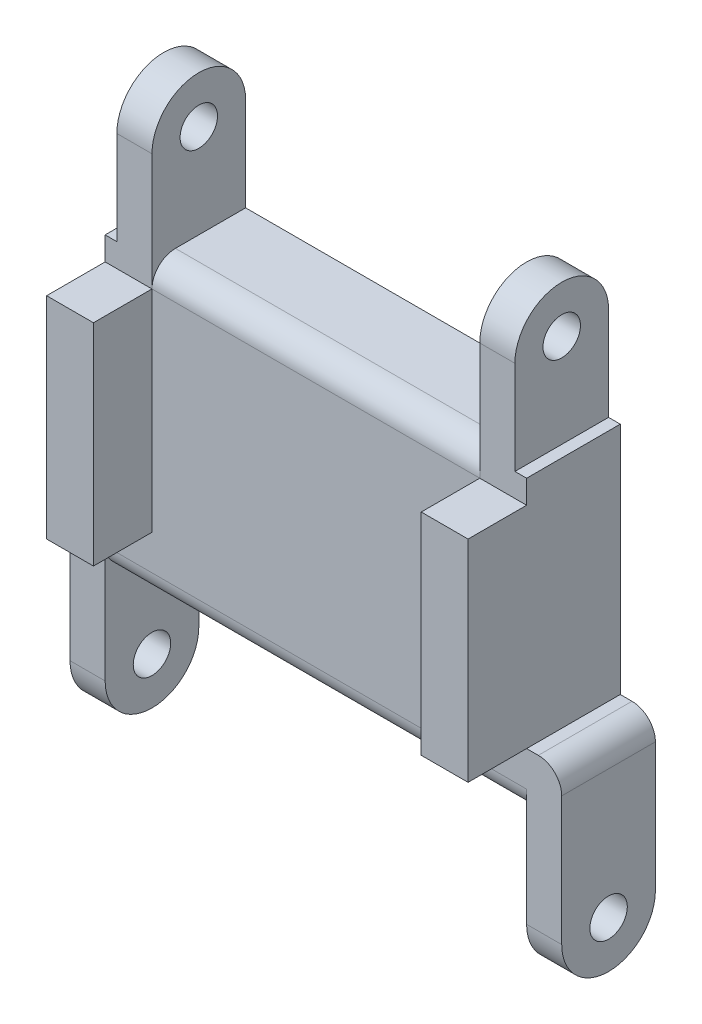
ISO-10303-21;
HEADER;
FILE_DESCRIPTION(('STEP AP214'),'2;1');
FILE_NAME('part.step','',(''),(''),'','','');
FILE_SCHEMA(('AUTOMOTIVE_DESIGN { 1 0 10303 214 1 1 1 1 }'));
ENDSEC;
DATA;
#1=APPLICATION_CONTEXT('core data for automotive mechanical design processes');
#2=APPLICATION_PROTOCOL_DEFINITION('international standard','automotive_design',2000,#1);
#3=PRODUCT_CONTEXT('',#1,'mechanical');
#4=PRODUCT('Part','Part','',(#3));
#5=PRODUCT_RELATED_PRODUCT_CATEGORY('part','',(#4));
#6=PRODUCT_DEFINITION_FORMATION('','',#4);
#7=PRODUCT_DEFINITION_CONTEXT('part definition',#1,'design');
#8=PRODUCT_DEFINITION('design','',#6,#7);
#9=PRODUCT_DEFINITION_SHAPE('','',#8);
#10=(LENGTH_UNIT() NAMED_UNIT(*) SI_UNIT(.MILLI.,.METRE.));
#11=(NAMED_UNIT(*) PLANE_ANGLE_UNIT() SI_UNIT($,.RADIAN.));
#12=(NAMED_UNIT(*) SI_UNIT($,.STERADIAN.) SOLID_ANGLE_UNIT());
#13=UNCERTAINTY_MEASURE_WITH_UNIT(LENGTH_MEASURE(1.E-05),#10,'distance_accuracy_value','');
#14=(GEOMETRIC_REPRESENTATION_CONTEXT(3) GLOBAL_UNCERTAINTY_ASSIGNED_CONTEXT((#13)) GLOBAL_UNIT_ASSIGNED_CONTEXT((#10,
#11,#12)) REPRESENTATION_CONTEXT('',''));
#15=CARTESIAN_POINT('',(0.,0.,0.));
#16=DIRECTION('',(0.,0.,1.));
#17=DIRECTION('',(1.,0.,0.));
#18=AXIS2_PLACEMENT_3D('',#15,#16,#17);
#19=CARTESIAN_POINT('',(0.,0.,8.));
#20=DIRECTION('',(0.,0.,-1.));
#21=DIRECTION('',(-1.,0.,0.));
#22=AXIS2_PLACEMENT_3D('',#19,#20,#21);
#23=PLANE('',#22);
#24=DIRECTION('',(1.,0.,0.));
#25=VECTOR('',#24,1.);
#26=CARTESIAN_POINT('',(32.,5.,8.));
#27=LINE('',#26,#25);
#28=CARTESIAN_POINT('',(32.,5.,8.));
#29=VERTEX_POINT('',#28);
#30=CARTESIAN_POINT('',(36.,5.,8.));
#31=VERTEX_POINT('',#30);
#32=EDGE_CURVE('E78',#29,#31,#27,.T.);
#33=ORIENTED_EDGE('',*,*,#32,.F.);
#34=DIRECTION('',(0.,-1.,0.));
#35=VECTOR('',#34,1.);
#36=CARTESIAN_POINT('',(32.,23.,8.));
#37=LINE('',#36,#35);
#38=CARTESIAN_POINT('',(32.,23.,8.));
#39=VERTEX_POINT('',#38);
#40=EDGE_CURVE('E303',#39,#29,#37,.T.);
#41=ORIENTED_EDGE('',*,*,#40,.F.);
#42=DIRECTION('',(-1.,0.,0.));
#43=VECTOR('',#42,1.);
#44=CARTESIAN_POINT('',(0.,23.,8.));
#45=LINE('',#44,#43);
#46=CARTESIAN_POINT('',(4.,23.,8.));
#47=VERTEX_POINT('',#46);
#48=EDGE_CURVE('E610',#39,#47,#45,.T.);
#49=ORIENTED_EDGE('',*,*,#48,.T.);
#50=DIRECTION('',(0.,1.,0.));
#51=VECTOR('',#50,1.);
#52=CARTESIAN_POINT('',(4.,23.,8.));
#53=LINE('',#52,#51);
#54=CARTESIAN_POINT('',(4.,5.,8.));
#55=VERTEX_POINT('',#54);
#56=EDGE_CURVE('E307',#55,#47,#53,.T.);
#57=ORIENTED_EDGE('',*,*,#56,.F.);
#58=DIRECTION('',(1.,0.,0.));
#59=VECTOR('',#58,1.);
#60=CARTESIAN_POINT('',(4.,5.,8.));
#61=LINE('',#60,#59);
#62=CARTESIAN_POINT('',(0.,5.,8.));
#63=VERTEX_POINT('',#62);
#64=EDGE_CURVE('E324',#63,#55,#61,.T.);
#65=ORIENTED_EDGE('',*,*,#64,.F.);
#66=DIRECTION('',(1.,0.,0.));
#67=VECTOR('',#66,1.);
#68=CARTESIAN_POINT('',(-3.,5.,8.));
#69=LINE('',#68,#67);
#70=CARTESIAN_POINT('',(-1.,5.,8.));
#71=VERTEX_POINT('',#70);
#72=EDGE_CURVE('E438',#71,#63,#69,.T.);
#73=ORIENTED_EDGE('',*,*,#72,.F.);
#74=CARTESIAN_POINT('',(-1.,3.,8.));
#75=DIRECTION('',(0.,0.,-1.));
#76=DIRECTION('',(-1.,0.,0.));
#77=AXIS2_PLACEMENT_3D('',#74,#75,#76);
#78=CIRCLE('',#77,2.);
#79=CARTESIAN_POINT('',(-3.,3.,8.));
#80=VERTEX_POINT('',#79);
#81=EDGE_CURVE('E580',#71,#80,#78,.F.);
#82=ORIENTED_EDGE('',*,*,#81,.T.);
#83=DIRECTION('',(0.,1.,0.));
#84=VECTOR('',#83,1.);
#85=CARTESIAN_POINT('',(-3.,0.,8.));
#86=LINE('',#85,#84);
#87=CARTESIAN_POINT('',(-3.,-8.,8.));
#88=VERTEX_POINT('',#87);
#89=EDGE_CURVE('E412',#88,#80,#86,.T.);
#90=ORIENTED_EDGE('',*,*,#89,.F.);
#91=DIRECTION('',(1.,0.,0.));
#92=VECTOR('',#91,1.);
#93=CARTESIAN_POINT('',(-3.,-8.,8.));
#94=LINE('',#93,#92);
#95=CARTESIAN_POINT('',(0.,-8.,8.));
#96=VERTEX_POINT('',#95);
#97=EDGE_CURVE('E442',#88,#96,#94,.T.);
#98=ORIENTED_EDGE('',*,*,#97,.T.);
#99=DIRECTION('',(0.,1.,0.));
#100=VECTOR('',#99,1.);
#101=CARTESIAN_POINT('',(0.,0.,8.));
#102=LINE('',#101,#100);
#103=CARTESIAN_POINT('',(0.,2.,8.));
#104=VERTEX_POINT('',#103);
#105=EDGE_CURVE('E426',#96,#104,#102,.T.);
#106=ORIENTED_EDGE('',*,*,#105,.T.);
#107=DIRECTION('',(1.,0.,0.));
#108=VECTOR('',#107,1.);
#109=CARTESIAN_POINT('',(0.,2.,8.));
#110=LINE('',#109,#108);
#111=CARTESIAN_POINT('',(36.,2.,8.));
#112=VERTEX_POINT('',#111);
#113=EDGE_CURVE('E596',#104,#112,#110,.T.);
#114=ORIENTED_EDGE('',*,*,#113,.T.);
#115=DIRECTION('',(0.,1.,0.));
#116=VECTOR('',#115,1.);
#117=CARTESIAN_POINT('',(36.,25.,8.));
#118=LINE('',#117,#116);
#119=CARTESIAN_POINT('',(36.,-8.,8.));
#120=VERTEX_POINT('',#119);
#121=EDGE_CURVE('E386',#120,#112,#118,.T.);
#122=ORIENTED_EDGE('',*,*,#121,.F.);
#123=DIRECTION('',(-1.,0.,0.));
#124=VECTOR('',#123,1.);
#125=CARTESIAN_POINT('',(39.,-8.,8.));
#126=LINE('',#125,#124);
#127=CARTESIAN_POINT('',(39.,-8.,8.));
#128=VERTEX_POINT('',#127);
#129=EDGE_CURVE('E399',#128,#120,#126,.T.);
#130=ORIENTED_EDGE('',*,*,#129,.F.);
#131=DIRECTION('',(0.,1.,0.));
#132=VECTOR('',#131,1.);
#133=CARTESIAN_POINT('',(39.,25.,8.));
#134=LINE('',#133,#132);
#135=CARTESIAN_POINT('',(39.,3.,8.));
#136=VERTEX_POINT('',#135);
#137=EDGE_CURVE('E375',#128,#136,#134,.T.);
#138=ORIENTED_EDGE('',*,*,#137,.T.);
#139=CARTESIAN_POINT('',(37.,3.,8.));
#140=DIRECTION('',(0.,0.,-1.));
#141=DIRECTION('',(-1.,0.,0.));
#142=AXIS2_PLACEMENT_3D('',#139,#140,#141);
#143=CIRCLE('',#142,2.);
#144=CARTESIAN_POINT('',(37.,5.,8.));
#145=VERTEX_POINT('',#144);
#146=EDGE_CURVE('E593',#136,#145,#143,.F.);
#147=ORIENTED_EDGE('',*,*,#146,.T.);
#148=DIRECTION('',(-1.,0.,0.));
#149=VECTOR('',#148,1.);
#150=CARTESIAN_POINT('',(39.,5.,8.));
#151=LINE('',#150,#149);
#152=EDGE_CURVE('E396',#145,#31,#151,.T.);
#153=ORIENTED_EDGE('',*,*,#152,.T.);
#154=EDGE_LOOP('',(#33,#41,#49,#57,#65,#73,#82,#90,#98,#106,#114,#122,#130,#138,#147,#153));
#155=FACE_BOUND('',#154,.T.);
#156=ADVANCED_FACE('F62',(#155),#23,.F.);
#157=DIRECTION('',(-1.,0.,0.));
#158=VECTOR('',#157,1.);
#159=CARTESIAN_POINT('',(32.,23.,8.));
#160=LINE('',#159,#158);
#161=CARTESIAN_POINT('',(36.,23.,8.));
#162=VERTEX_POINT('',#161);
#163=EDGE_CURVE('E277',#162,#39,#160,.T.);
#164=ORIENTED_EDGE('',*,*,#163,.F.);
#165=DIRECTION('',(0.,1.,0.));
#166=VECTOR('',#165,1.);
#167=CARTESIAN_POINT('',(36.,25.,8.));
#168=LINE('',#167,#166);
#169=CARTESIAN_POINT('',(36.,25.,8.));
#170=VERTEX_POINT('',#169);
#171=EDGE_CURVE('E260',#162,#170,#168,.T.);
#172=ORIENTED_EDGE('',*,*,#171,.T.);
#173=DIRECTION('',(-1.,0.,0.));
#174=VECTOR('',#173,1.);
#175=CARTESIAN_POINT('',(0.,25.,8.));
#176=LINE('',#175,#174);
#177=CARTESIAN_POINT('',(35.,25.,8.));
#178=VERTEX_POINT('',#177);
#179=EDGE_CURVE('E541',#170,#178,#176,.T.);
#180=ORIENTED_EDGE('',*,*,#179,.T.);
#181=DIRECTION('',(0.,1.,0.));
#182=VECTOR('',#181,1.);
#183=CARTESIAN_POINT('',(35.,0.,8.));
#184=LINE('',#183,#182);
#185=CARTESIAN_POINT('',(35.,33.,8.));
#186=VERTEX_POINT('',#185);
#187=EDGE_CURVE('E522',#178,#186,#184,.T.);
#188=ORIENTED_EDGE('',*,*,#187,.T.);
#189=DIRECTION('',(1.,0.,0.));
#190=VECTOR('',#189,1.);
#191=CARTESIAN_POINT('',(32.,33.,8.));
#192=LINE('',#191,#190);
#193=CARTESIAN_POINT('',(32.,33.,8.));
#194=VERTEX_POINT('',#193);
#195=EDGE_CURVE('E532',#194,#186,#192,.T.);
#196=ORIENTED_EDGE('',*,*,#195,.F.);
#197=DIRECTION('',(0.,1.,0.));
#198=VECTOR('',#197,1.);
#199=CARTESIAN_POINT('',(32.,0.,8.));
#200=LINE('',#199,#198);
#201=EDGE_CURVE('E280',#39,#194,#200,.T.);
#202=ORIENTED_EDGE('',*,*,#201,.F.);
#203=EDGE_LOOP('',(#164,#172,#180,#188,#196,#202));
#204=FACE_BOUND('',#203,.T.);
#205=ADVANCED_FACE('F278',(#204),#23,.F.);
#206=DIRECTION('',(-1.,0.,0.));
#207=VECTOR('',#206,1.);
#208=CARTESIAN_POINT('',(4.,23.,8.));
#209=LINE('',#208,#207);
#210=CARTESIAN_POINT('',(0.,23.,8.));
#211=VERTEX_POINT('',#210);
#212=EDGE_CURVE('E337',#47,#211,#209,.T.);
#213=ORIENTED_EDGE('',*,*,#212,.F.);
#214=DIRECTION('',(0.,1.,0.));
#215=VECTOR('',#214,1.);
#216=CARTESIAN_POINT('',(4.,0.,8.));
#217=LINE('',#216,#215);
#218=CARTESIAN_POINT('',(4.,33.,8.));
#219=VERTEX_POINT('',#218);
#220=EDGE_CURVE('E459',#47,#219,#217,.T.);
#221=ORIENTED_EDGE('',*,*,#220,.T.);
#222=DIRECTION('',(-1.,0.,0.));
#223=VECTOR('',#222,1.);
#224=CARTESIAN_POINT('',(4.,33.,8.));
#225=LINE('',#224,#223);
#226=CARTESIAN_POINT('',(1.,33.,8.));
#227=VERTEX_POINT('',#226);
#228=EDGE_CURVE('E491',#219,#227,#225,.T.);
#229=ORIENTED_EDGE('',*,*,#228,.T.);
#230=DIRECTION('',(0.,1.,0.));
#231=VECTOR('',#230,1.);
#232=CARTESIAN_POINT('',(1.,0.,8.));
#233=LINE('',#232,#231);
#234=CARTESIAN_POINT('',(1.,25.,8.));
#235=VERTEX_POINT('',#234);
#236=EDGE_CURVE('E478',#235,#227,#233,.T.);
#237=ORIENTED_EDGE('',*,*,#236,.F.);
#238=CARTESIAN_POINT('',(0.,25.,8.));
#239=VERTEX_POINT('',#238);
#240=EDGE_CURVE('E273',#235,#239,#176,.T.);
#241=ORIENTED_EDGE('',*,*,#240,.T.);
#242=DIRECTION('',(0.,-1.,0.));
#243=VECTOR('',#242,1.);
#244=CARTESIAN_POINT('',(0.,0.,8.));
#245=LINE('',#244,#243);
#246=EDGE_CURVE('E86',#239,#211,#245,.T.);
#247=ORIENTED_EDGE('',*,*,#246,.T.);
#248=EDGE_LOOP('',(#213,#221,#229,#237,#241,#247));
#249=FACE_BOUND('',#248,.T.);
#250=ADVANCED_FACE('F729',(#249),#23,.F.);
#251=CARTESIAN_POINT('',(0.,0.,8.));
#252=DIRECTION('',(1.,0.,0.));
#253=DIRECTION('',(0.,0.,-1.));
#254=AXIS2_PLACEMENT_3D('',#251,#252,#253);
#255=PLANE('',#254);
#256=DIRECTION('',(0.,0.,-1.));
#257=VECTOR('',#256,1.);
#258=CARTESIAN_POINT('',(0.,5.,0.));
#259=LINE('',#258,#257);
#260=CARTESIAN_POINT('',(0.,5.,0.));
#261=VERTEX_POINT('',#260);
#262=EDGE_CURVE('E429',#63,#261,#259,.T.);
#263=ORIENTED_EDGE('',*,*,#262,.F.);
#264=DIRECTION('',(0.,0.,-1.));
#265=VECTOR('',#264,1.);
#266=CARTESIAN_POINT('',(0.,5.,13.));
#267=LINE('',#266,#265);
#268=CARTESIAN_POINT('',(0.,5.,13.));
#269=VERTEX_POINT('',#268);
#270=EDGE_CURVE('E346',#269,#63,#267,.T.);
#271=ORIENTED_EDGE('',*,*,#270,.F.);
#272=DIRECTION('',(0.,-1.,0.));
#273=VECTOR('',#272,1.);
#274=CARTESIAN_POINT('',(0.,23.,13.));
#275=LINE('',#274,#273);
#276=CARTESIAN_POINT('',(0.,23.,13.));
#277=VERTEX_POINT('',#276);
#278=EDGE_CURVE('E327',#277,#269,#275,.T.);
#279=ORIENTED_EDGE('',*,*,#278,.F.);
#280=DIRECTION('',(0.,0.,-1.));
#281=VECTOR('',#280,1.);
#282=CARTESIAN_POINT('',(0.,23.,13.));
#283=LINE('',#282,#281);
#284=EDGE_CURVE('E350',#277,#211,#283,.T.);
#285=ORIENTED_EDGE('',*,*,#284,.T.);
#286=ORIENTED_EDGE('',*,*,#246,.F.);
#287=DIRECTION('',(0.,0.,-1.));
#288=VECTOR('',#287,1.);
#289=CARTESIAN_POINT('',(0.,25.,8.));
#290=LINE('',#289,#288);
#291=CARTESIAN_POINT('',(0.,25.,0.));
#292=VERTEX_POINT('',#291);
#293=EDGE_CURVE('E544',#239,#292,#290,.T.);
#294=ORIENTED_EDGE('',*,*,#293,.T.);
#295=DIRECTION('',(0.,-1.,0.));
#296=VECTOR('',#295,1.);
#297=CARTESIAN_POINT('',(0.,0.,0.));
#298=LINE('',#297,#296);
#299=EDGE_CURVE('E535',#292,#261,#298,.T.);
#300=ORIENTED_EDGE('',*,*,#299,.T.);
#301=EDGE_LOOP('',(#263,#271,#279,#285,#286,#294,#300));
#302=FACE_BOUND('',#301,.T.);
#303=ADVANCED_FACE('F649',(#302),#255,.F.);
#304=CARTESIAN_POINT('',(0.,25.,8.));
#305=DIRECTION('',(0.,-1.,0.));
#306=DIRECTION('',(0.,0.,-1.));
#307=AXIS2_PLACEMENT_3D('',#304,#305,#306);
#308=PLANE('',#307);
#309=DIRECTION('',(0.,0.,1.));
#310=VECTOR('',#309,1.);
#311=CARTESIAN_POINT('',(1.,25.,0.));
#312=LINE('',#311,#310);
#313=CARTESIAN_POINT('',(1.,25.,0.));
#314=VERTEX_POINT('',#313);
#315=EDGE_CURVE('E482',#314,#235,#312,.T.);
#316=ORIENTED_EDGE('',*,*,#315,.F.);
#317=DIRECTION('',(-1.,0.,0.));
#318=VECTOR('',#317,1.);
#319=CARTESIAN_POINT('',(0.,25.,0.));
#320=LINE('',#319,#318);
#321=EDGE_CURVE('E555',#314,#292,#320,.T.);
#322=ORIENTED_EDGE('',*,*,#321,.T.);
#323=ORIENTED_EDGE('',*,*,#293,.F.);
#324=ORIENTED_EDGE('',*,*,#240,.F.);
#325=EDGE_LOOP('',(#316,#322,#323,#324));
#326=FACE_BOUND('',#325,.T.);
#327=ADVANCED_FACE('F644',(#326),#308,.F.);
#328=DIRECTION('',(0.,0.,1.));
#329=VECTOR('',#328,1.);
#330=CARTESIAN_POINT('',(4.,25.,0.));
#331=LINE('',#330,#329);
#332=CARTESIAN_POINT('',(4.,25.,0.));
#333=VERTEX_POINT('',#332);
#334=CARTESIAN_POINT('',(4.,25.,6.));
#335=VERTEX_POINT('',#334);
#336=EDGE_CURVE('E463',#333,#335,#331,.T.);
#337=ORIENTED_EDGE('',*,*,#336,.T.);
#338=DIRECTION('',(-1.,0.,0.));
#339=VECTOR('',#338,1.);
#340=CARTESIAN_POINT('',(0.,25.,6.));
#341=LINE('',#340,#339);
#342=CARTESIAN_POINT('',(32.,25.,6.));
#343=VERTEX_POINT('',#342);
#344=EDGE_CURVE('E614',#335,#343,#341,.F.);
#345=ORIENTED_EDGE('',*,*,#344,.T.);
#346=DIRECTION('',(0.,0.,1.));
#347=VECTOR('',#346,1.);
#348=CARTESIAN_POINT('',(32.,25.,0.));
#349=LINE('',#348,#347);
#350=CARTESIAN_POINT('',(32.,25.,0.));
#351=VERTEX_POINT('',#350);
#352=EDGE_CURVE('E506',#351,#343,#349,.T.);
#353=ORIENTED_EDGE('',*,*,#352,.F.);
#354=EDGE_CURVE('E558',#351,#333,#320,.T.);
#355=ORIENTED_EDGE('',*,*,#354,.T.);
#356=EDGE_LOOP('',(#337,#345,#353,#355));
#357=FACE_BOUND('',#356,.T.);
#358=ADVANCED_FACE('F626',(#357),#308,.F.);
#359=CARTESIAN_POINT('',(0.,0.,8.));
#360=DIRECTION('',(0.,1.,0.));
#361=DIRECTION('',(0.,0.,1.));
#362=AXIS2_PLACEMENT_3D('',#359,#360,#361);
#363=PLANE('',#362);
#364=DIRECTION('',(0.,0.,-1.));
#365=VECTOR('',#364,1.);
#366=CARTESIAN_POINT('',(36.,0.,8.));
#367=LINE('',#366,#365);
#368=CARTESIAN_POINT('',(36.,0.,6.));
#369=VERTEX_POINT('',#368);
#370=CARTESIAN_POINT('',(36.,0.,0.));
#371=VERTEX_POINT('',#370);
#372=EDGE_CURVE('E564',#369,#371,#367,.T.);
#373=ORIENTED_EDGE('',*,*,#372,.F.);
#374=DIRECTION('',(1.,0.,0.));
#375=VECTOR('',#374,1.);
#376=CARTESIAN_POINT('',(0.,0.,6.));
#377=LINE('',#376,#375);
#378=CARTESIAN_POINT('',(0.,0.,6.));
#379=VERTEX_POINT('',#378);
#380=EDGE_CURVE('E600',#369,#379,#377,.F.);
#381=ORIENTED_EDGE('',*,*,#380,.T.);
#382=DIRECTION('',(0.,0.,-1.));
#383=VECTOR('',#382,1.);
#384=CARTESIAN_POINT('',(0.,0.,8.));
#385=LINE('',#384,#383);
#386=CARTESIAN_POINT('',(0.,0.,0.));
#387=VERTEX_POINT('',#386);
#388=EDGE_CURVE('E567',#379,#387,#385,.T.);
#389=ORIENTED_EDGE('',*,*,#388,.T.);
#390=DIRECTION('',(1.,0.,0.));
#391=VECTOR('',#390,1.);
#392=CARTESIAN_POINT('',(0.,0.,0.));
#393=LINE('',#392,#391);
#394=EDGE_CURVE('E548',#387,#371,#393,.T.);
#395=ORIENTED_EDGE('',*,*,#394,.T.);
#396=EDGE_LOOP('',(#373,#381,#389,#395));
#397=FACE_BOUND('',#396,.T.);
#398=ADVANCED_FACE('F1130',(#397),#363,.F.);
#399=CARTESIAN_POINT('',(36.,25.,8.));
#400=DIRECTION('',(-1.,0.,0.));
#401=DIRECTION('',(0.,0.,1.));
#402=AXIS2_PLACEMENT_3D('',#399,#400,#401);
#403=PLANE('',#402);
#404=ORIENTED_EDGE('',*,*,#171,.F.);
#405=DIRECTION('',(0.,0.,-1.));
#406=VECTOR('',#405,1.);
#407=CARTESIAN_POINT('',(36.,23.,13.));
#408=LINE('',#407,#406);
#409=CARTESIAN_POINT('',(36.,23.,13.));
#410=VERTEX_POINT('',#409);
#411=EDGE_CURVE('E265',#410,#162,#408,.T.);
#412=ORIENTED_EDGE('',*,*,#411,.F.);
#413=DIRECTION('',(0.,1.,0.));
#414=VECTOR('',#413,1.);
#415=CARTESIAN_POINT('',(36.,23.,13.));
#416=LINE('',#415,#414);
#417=CARTESIAN_POINT('',(36.,5.,13.));
#418=VERTEX_POINT('',#417);
#419=EDGE_CURVE('E310',#418,#410,#416,.T.);
#420=ORIENTED_EDGE('',*,*,#419,.F.);
#421=DIRECTION('',(0.,0.,-1.));
#422=VECTOR('',#421,1.);
#423=CARTESIAN_POINT('',(36.,5.,13.));
#424=LINE('',#423,#422);
#425=EDGE_CURVE('E291',#418,#31,#424,.T.);
#426=ORIENTED_EDGE('',*,*,#425,.T.);
#427=DIRECTION('',(0.,0.,-1.));
#428=VECTOR('',#427,1.);
#429=CARTESIAN_POINT('',(36.,5.,8.));
#430=LINE('',#429,#428);
#431=CARTESIAN_POINT('',(36.,5.,0.));
#432=VERTEX_POINT('',#431);
#433=EDGE_CURVE('E371',#31,#432,#430,.T.);
#434=ORIENTED_EDGE('',*,*,#433,.T.);
#435=DIRECTION('',(0.,1.,0.));
#436=VECTOR('',#435,1.);
#437=CARTESIAN_POINT('',(36.,25.,0.));
#438=LINE('',#437,#436);
#439=CARTESIAN_POINT('',(36.,25.,0.));
#440=VERTEX_POINT('',#439);
#441=EDGE_CURVE('E552',#432,#440,#438,.T.);
#442=ORIENTED_EDGE('',*,*,#441,.T.);
#443=DIRECTION('',(0.,0.,-1.));
#444=VECTOR('',#443,1.);
#445=CARTESIAN_POINT('',(36.,25.,8.));
#446=LINE('',#445,#444);
#447=EDGE_CURVE('E268',#170,#440,#446,.T.);
#448=ORIENTED_EDGE('',*,*,#447,.F.);
#449=EDGE_LOOP('',(#404,#412,#420,#426,#434,#442,#448));
#450=FACE_BOUND('',#449,.T.);
#451=ADVANCED_FACE('F262',(#450),#403,.F.);
#452=CARTESIAN_POINT('',(35.,25.,0.));
#453=VERTEX_POINT('',#452);
#454=EDGE_CURVE('E539',#440,#453,#320,.T.);
#455=ORIENTED_EDGE('',*,*,#454,.T.);
#456=DIRECTION('',(0.,0.,1.));
#457=VECTOR('',#456,1.);
#458=CARTESIAN_POINT('',(35.,25.,0.));
#459=LINE('',#458,#457);
#460=EDGE_CURVE('E526',#453,#178,#459,.T.);
#461=ORIENTED_EDGE('',*,*,#460,.T.);
#462=ORIENTED_EDGE('',*,*,#179,.F.);
#463=ORIENTED_EDGE('',*,*,#447,.T.);
#464=EDGE_LOOP('',(#455,#461,#462,#463));
#465=FACE_BOUND('',#464,.T.);
#466=ADVANCED_FACE('F708',(#465),#308,.F.);
#467=CARTESIAN_POINT('',(0.,0.,0.));
#468=DIRECTION('',(0.,0.,-1.));
#469=DIRECTION('',(-1.,0.,0.));
#470=AXIS2_PLACEMENT_3D('',#467,#468,#469);
#471=PLANE('',#470);
#472=DIRECTION('',(-1.,0.,0.));
#473=VECTOR('',#472,1.);
#474=CARTESIAN_POINT('',(39.,5.,0.));
#475=LINE('',#474,#473);
#476=CARTESIAN_POINT('',(37.,5.,0.));
#477=VERTEX_POINT('',#476);
#478=EDGE_CURVE('E392',#477,#432,#475,.T.);
#479=ORIENTED_EDGE('',*,*,#478,.F.);
#480=CARTESIAN_POINT('',(37.,3.,0.));
#481=DIRECTION('',(0.,0.,-1.));
#482=DIRECTION('',(-1.,0.,0.));
#483=AXIS2_PLACEMENT_3D('',#480,#481,#482);
#484=CIRCLE('',#483,2.);
#485=CARTESIAN_POINT('',(39.,3.,0.));
#486=VERTEX_POINT('',#485);
#487=EDGE_CURVE('E587',#477,#486,#484,.T.);
#488=ORIENTED_EDGE('',*,*,#487,.T.);
#489=DIRECTION('',(0.,-1.,0.));
#490=VECTOR('',#489,1.);
#491=CARTESIAN_POINT('',(39.,25.,0.));
#492=LINE('',#491,#490);
#493=CARTESIAN_POINT('',(39.,-8.,0.));
#494=VERTEX_POINT('',#493);
#495=EDGE_CURVE('E367',#486,#494,#492,.T.);
#496=ORIENTED_EDGE('',*,*,#495,.T.);
#497=DIRECTION('',(-1.,0.,0.));
#498=VECTOR('',#497,1.);
#499=CARTESIAN_POINT('',(39.,-8.,0.));
#500=LINE('',#499,#498);
#501=CARTESIAN_POINT('',(36.,-8.,0.));
#502=VERTEX_POINT('',#501);
#503=EDGE_CURVE('E379',#494,#502,#500,.T.);
#504=ORIENTED_EDGE('',*,*,#503,.T.);
#505=DIRECTION('',(0.,-1.,0.));
#506=VECTOR('',#505,1.);
#507=CARTESIAN_POINT('',(36.,25.,0.));
#508=LINE('',#507,#506);
#509=EDGE_CURVE('E363',#371,#502,#508,.T.);
#510=ORIENTED_EDGE('',*,*,#509,.F.);
#511=ORIENTED_EDGE('',*,*,#394,.F.);
#512=DIRECTION('',(0.,-1.,0.));
#513=VECTOR('',#512,1.);
#514=CARTESIAN_POINT('',(0.,0.,0.));
#515=LINE('',#514,#513);
#516=CARTESIAN_POINT('',(0.,-8.,0.));
#517=VERTEX_POINT('',#516);
#518=EDGE_CURVE('E395',#387,#517,#515,.T.);
#519=ORIENTED_EDGE('',*,*,#518,.T.);
#520=DIRECTION('',(1.,0.,0.));
#521=VECTOR('',#520,1.);
#522=CARTESIAN_POINT('',(-3.,-8.,0.));
#523=LINE('',#522,#521);
#524=CARTESIAN_POINT('',(-3.,-8.,0.));
#525=VERTEX_POINT('',#524);
#526=EDGE_CURVE('E446',#525,#517,#523,.T.);
#527=ORIENTED_EDGE('',*,*,#526,.F.);
#528=DIRECTION('',(0.,-1.,0.));
#529=VECTOR('',#528,1.);
#530=CARTESIAN_POINT('',(-3.,0.,0.));
#531=LINE('',#530,#529);
#532=CARTESIAN_POINT('',(-3.,3.,0.));
#533=VERTEX_POINT('',#532);
#534=EDGE_CURVE('E405',#533,#525,#531,.T.);
#535=ORIENTED_EDGE('',*,*,#534,.F.);
#536=CARTESIAN_POINT('',(-1.,3.,0.));
#537=DIRECTION('',(0.,0.,-1.));
#538=DIRECTION('',(-1.,0.,0.));
#539=AXIS2_PLACEMENT_3D('',#536,#537,#538);
#540=CIRCLE('',#539,2.);
#541=CARTESIAN_POINT('',(-1.,5.,0.));
#542=VERTEX_POINT('',#541);
#543=EDGE_CURVE('E574',#533,#542,#540,.T.);
#544=ORIENTED_EDGE('',*,*,#543,.T.);
#545=DIRECTION('',(1.,0.,0.));
#546=VECTOR('',#545,1.);
#547=CARTESIAN_POINT('',(-3.,5.,0.));
#548=LINE('',#547,#546);
#549=EDGE_CURVE('E420',#542,#261,#548,.T.);
#550=ORIENTED_EDGE('',*,*,#549,.T.);
#551=ORIENTED_EDGE('',*,*,#299,.F.);
#552=ORIENTED_EDGE('',*,*,#321,.F.);
#553=DIRECTION('',(0.,1.,0.));
#554=VECTOR('',#553,1.);
#555=CARTESIAN_POINT('',(1.,0.,0.));
#556=LINE('',#555,#554);
#557=CARTESIAN_POINT('',(1.,33.,0.));
#558=VERTEX_POINT('',#557);
#559=EDGE_CURVE('E456',#314,#558,#556,.T.);
#560=ORIENTED_EDGE('',*,*,#559,.T.);
#561=DIRECTION('',(-1.,0.,0.));
#562=VECTOR('',#561,1.);
#563=CARTESIAN_POINT('',(4.,33.,0.));
#564=LINE('',#563,#562);
#565=CARTESIAN_POINT('',(4.,33.,0.));
#566=VERTEX_POINT('',#565);
#567=EDGE_CURVE('E470',#566,#558,#564,.T.);
#568=ORIENTED_EDGE('',*,*,#567,.F.);
#569=DIRECTION('',(0.,1.,0.));
#570=VECTOR('',#569,1.);
#571=CARTESIAN_POINT('',(4.,0.,0.));
#572=LINE('',#571,#570);
#573=EDGE_CURVE('E467',#333,#566,#572,.T.);
#574=ORIENTED_EDGE('',*,*,#573,.F.);
#575=ORIENTED_EDGE('',*,*,#354,.F.);
#576=DIRECTION('',(0.,1.,0.));
#577=VECTOR('',#576,1.);
#578=CARTESIAN_POINT('',(32.,0.,0.));
#579=LINE('',#578,#577);
#580=CARTESIAN_POINT('',(32.,33.,0.));
#581=VERTEX_POINT('',#580);
#582=EDGE_CURVE('E495',#351,#581,#579,.T.);
#583=ORIENTED_EDGE('',*,*,#582,.T.);
#584=DIRECTION('',(1.,0.,0.));
#585=VECTOR('',#584,1.);
#586=CARTESIAN_POINT('',(32.,33.,0.));
#587=LINE('',#586,#585);
#588=CARTESIAN_POINT('',(35.,33.,0.));
#589=VERTEX_POINT('',#588);
#590=EDGE_CURVE('E514',#581,#589,#587,.T.);
#591=ORIENTED_EDGE('',*,*,#590,.T.);
#592=DIRECTION('',(0.,1.,0.));
#593=VECTOR('',#592,1.);
#594=CARTESIAN_POINT('',(35.,0.,0.));
#595=LINE('',#594,#593);
#596=EDGE_CURVE('E494',#453,#589,#595,.T.);
#597=ORIENTED_EDGE('',*,*,#596,.F.);
#598=ORIENTED_EDGE('',*,*,#454,.F.);
#599=ORIENTED_EDGE('',*,*,#441,.F.);
#600=EDGE_LOOP('',(#479,#488,#496,#504,#510,#511,#519,#527,#535,#544,#550,#551,#552,#560,#568,
#574,#575,#583,#591,#597,#598,#599));
#601=FACE_BOUND('',#600,.T.);
#602=ADVANCED_FACE('F637',(#601),#471,.T.);
#603=CARTESIAN_POINT('',(32.,33.,4.));
#604=DIRECTION('',(1.,0.,0.));
#605=DIRECTION('',(0.,0.,-1.));
#606=AXIS2_PLACEMENT_3D('',#603,#604,#605);
#607=CYLINDRICAL_SURFACE('',#606,4.);
#608=CARTESIAN_POINT('',(35.,33.,4.));
#609=DIRECTION('',(1.,0.,0.));
#610=DIRECTION('',(0.,0.,-1.));
#611=AXIS2_PLACEMENT_3D('',#608,#609,#610);
#612=CIRCLE('',#611,4.);
#613=EDGE_CURVE('E518',#589,#186,#612,.T.);
#614=ORIENTED_EDGE('',*,*,#613,.F.);
#615=ORIENTED_EDGE('',*,*,#590,.F.);
#616=CARTESIAN_POINT('',(32.,33.,4.));
#617=DIRECTION('',(1.,0.,0.));
#618=DIRECTION('',(0.,0.,-1.));
#619=AXIS2_PLACEMENT_3D('',#616,#617,#618);
#620=CIRCLE('',#619,4.);
#621=EDGE_CURVE('E499',#581,#194,#620,.T.);
#622=ORIENTED_EDGE('',*,*,#621,.T.);
#623=ORIENTED_EDGE('',*,*,#195,.T.);
#624=EDGE_LOOP('',(#614,#615,#622,#623));
#625=FACE_BOUND('',#624,.T.);
#626=ADVANCED_FACE('F716',(#625),#607,.T.);
#627=CARTESIAN_POINT('',(32.,33.,4.));
#628=DIRECTION('',(1.,0.,0.));
#629=DIRECTION('',(0.,0.,-1.));
#630=AXIS2_PLACEMENT_3D('',#627,#628,#629);
#631=CYLINDRICAL_SURFACE('',#630,1.6);
#632=CARTESIAN_POINT('',(32.,33.,4.));
#633=DIRECTION('',(1.,0.,0.));
#634=DIRECTION('',(0.,0.,-1.));
#635=AXIS2_PLACEMENT_3D('',#632,#633,#634);
#636=CIRCLE('',#635,1.6);
#637=CARTESIAN_POINT('',(32.,33.,2.4));
#638=VERTEX_POINT('',#637);
#639=EDGE_CURVE('E510',#638,#638,#636,.T.);
#640=ORIENTED_EDGE('',*,*,#639,.F.);
#641=EDGE_LOOP('',(#640));
#642=FACE_BOUND('',#641,.T.);
#643=CARTESIAN_POINT('',(35.,33.,4.));
#644=DIRECTION('',(1.,0.,0.));
#645=DIRECTION('',(0.,0.,-1.));
#646=AXIS2_PLACEMENT_3D('',#643,#644,#645);
#647=CIRCLE('',#646,1.6);
#648=CARTESIAN_POINT('',(35.,33.,2.4));
#649=VERTEX_POINT('',#648);
#650=EDGE_CURVE('E500',#649,#649,#647,.T.);
#651=ORIENTED_EDGE('',*,*,#650,.T.);
#652=EDGE_LOOP('',(#651));
#653=FACE_BOUND('',#652,.T.);
#654=ADVANCED_FACE('F718',(#642,#653),#631,.F.);
#655=CARTESIAN_POINT('',(32.,0.,0.));
#656=DIRECTION('',(1.,0.,0.));
#657=DIRECTION('',(0.,0.,-1.));
#658=AXIS2_PLACEMENT_3D('',#655,#656,#657);
#659=PLANE('',#658);
#660=ORIENTED_EDGE('',*,*,#582,.F.);
#661=ORIENTED_EDGE('',*,*,#352,.T.);
#662=CARTESIAN_POINT('',(32.,23.,6.));
#663=DIRECTION('',(1.,0.,0.));
#664=DIRECTION('',(0.,0.,-1.));
#665=AXIS2_PLACEMENT_3D('',#662,#663,#664);
#666=CIRCLE('',#665,2.);
#667=EDGE_CURVE('E12',#343,#39,#666,.T.);
#668=ORIENTED_EDGE('',*,*,#667,.T.);
#669=ORIENTED_EDGE('',*,*,#201,.T.);
#670=ORIENTED_EDGE('',*,*,#621,.F.);
#671=EDGE_LOOP('',(#660,#661,#668,#669,#670));
#672=FACE_BOUND('',#671,.T.);
#673=ORIENTED_EDGE('',*,*,#639,.T.);
#674=EDGE_LOOP('',(#673));
#675=FACE_BOUND('',#674,.T.);
#676=ADVANCED_FACE('F632',(#672,#675),#659,.F.);
#677=CARTESIAN_POINT('',(35.,0.,0.));
#678=DIRECTION('',(1.,0.,0.));
#679=DIRECTION('',(0.,0.,-1.));
#680=AXIS2_PLACEMENT_3D('',#677,#678,#679);
#681=PLANE('',#680);
#682=ORIENTED_EDGE('',*,*,#596,.T.);
#683=ORIENTED_EDGE('',*,*,#613,.T.);
#684=ORIENTED_EDGE('',*,*,#187,.F.);
#685=ORIENTED_EDGE('',*,*,#460,.F.);
#686=EDGE_LOOP('',(#682,#683,#684,#685));
#687=FACE_BOUND('',#686,.T.);
#688=ORIENTED_EDGE('',*,*,#650,.F.);
#689=EDGE_LOOP('',(#688));
#690=FACE_BOUND('',#689,.T.);
#691=ADVANCED_FACE('F712',(#687,#690),#681,.T.);
#692=CARTESIAN_POINT('',(4.,33.,4.));
#693=DIRECTION('',(-1.,0.,0.));
#694=DIRECTION('',(0.,0.,1.));
#695=AXIS2_PLACEMENT_3D('',#692,#693,#694);
#696=CYLINDRICAL_SURFACE('',#695,4.);
#697=CARTESIAN_POINT('',(1.,33.,4.));
#698=DIRECTION('',(1.,0.,0.));
#699=DIRECTION('',(0.,0.,-1.));
#700=AXIS2_PLACEMENT_3D('',#697,#698,#699);
#701=CIRCLE('',#700,4.);
#702=EDGE_CURVE('E474',#558,#227,#701,.T.);
#703=ORIENTED_EDGE('',*,*,#702,.T.);
#704=ORIENTED_EDGE('',*,*,#228,.F.);
#705=CARTESIAN_POINT('',(4.,33.,4.));
#706=DIRECTION('',(1.,0.,0.));
#707=DIRECTION('',(0.,0.,-1.));
#708=AXIS2_PLACEMENT_3D('',#705,#706,#707);
#709=CIRCLE('',#708,4.);
#710=EDGE_CURVE('E455',#566,#219,#709,.T.);
#711=ORIENTED_EDGE('',*,*,#710,.F.);
#712=ORIENTED_EDGE('',*,*,#567,.T.);
#713=EDGE_LOOP('',(#703,#704,#711,#712));
#714=FACE_BOUND('',#713,.T.);
#715=ADVANCED_FACE('F800',(#714),#696,.T.);
#716=CARTESIAN_POINT('',(4.,33.,4.));
#717=DIRECTION('',(-1.,0.,0.));
#718=DIRECTION('',(0.,0.,1.));
#719=AXIS2_PLACEMENT_3D('',#716,#717,#718);
#720=CYLINDRICAL_SURFACE('',#719,1.6);
#721=CARTESIAN_POINT('',(4.,33.,4.));
#722=DIRECTION('',(1.,0.,0.));
#723=DIRECTION('',(0.,0.,-1.));
#724=AXIS2_PLACEMENT_3D('',#721,#722,#723);
#725=CIRCLE('',#724,1.6);
#726=CARTESIAN_POINT('',(4.,33.,2.4));
#727=VERTEX_POINT('',#726);
#728=EDGE_CURVE('E451',#727,#727,#725,.T.);
#729=ORIENTED_EDGE('',*,*,#728,.T.);
#730=EDGE_LOOP('',(#729));
#731=FACE_BOUND('',#730,.T.);
#732=CARTESIAN_POINT('',(1.,33.,4.));
#733=DIRECTION('',(1.,0.,0.));
#734=DIRECTION('',(0.,0.,-1.));
#735=AXIS2_PLACEMENT_3D('',#732,#733,#734);
#736=CIRCLE('',#735,1.6);
#737=CARTESIAN_POINT('',(1.,33.,2.4));
#738=VERTEX_POINT('',#737);
#739=EDGE_CURVE('E450',#738,#738,#736,.T.);
#740=ORIENTED_EDGE('',*,*,#739,.F.);
#741=EDGE_LOOP('',(#740));
#742=FACE_BOUND('',#741,.T.);
#743=ADVANCED_FACE('F795',(#731,#742),#720,.F.);
#744=CARTESIAN_POINT('',(4.,0.,0.));
#745=DIRECTION('',(1.,0.,0.));
#746=DIRECTION('',(0.,0.,-1.));
#747=AXIS2_PLACEMENT_3D('',#744,#745,#746);
#748=PLANE('',#747);
#749=ORIENTED_EDGE('',*,*,#728,.F.);
#750=EDGE_LOOP('',(#749));
#751=FACE_BOUND('',#750,.T.);
#752=ORIENTED_EDGE('',*,*,#710,.T.);
#753=ORIENTED_EDGE('',*,*,#220,.F.);
#754=CARTESIAN_POINT('',(4.,23.,6.));
#755=DIRECTION('',(1.,0.,0.));
#756=DIRECTION('',(0.,0.,-1.));
#757=AXIS2_PLACEMENT_3D('',#754,#755,#756);
#758=CIRCLE('',#757,2.);
#759=EDGE_CURVE('E71',#47,#335,#758,.F.);
#760=ORIENTED_EDGE('',*,*,#759,.T.);
#761=ORIENTED_EDGE('',*,*,#336,.F.);
#762=ORIENTED_EDGE('',*,*,#573,.T.);
#763=EDGE_LOOP('',(#752,#753,#760,#761,#762));
#764=FACE_BOUND('',#763,.T.);
#765=ADVANCED_FACE('F621',(#751,#764),#748,.T.);
#766=CARTESIAN_POINT('',(1.,0.,0.));
#767=DIRECTION('',(1.,0.,0.));
#768=DIRECTION('',(0.,0.,-1.));
#769=AXIS2_PLACEMENT_3D('',#766,#767,#768);
#770=PLANE('',#769);
#771=ORIENTED_EDGE('',*,*,#739,.T.);
#772=EDGE_LOOP('',(#771));
#773=FACE_BOUND('',#772,.T.);
#774=ORIENTED_EDGE('',*,*,#702,.F.);
#775=ORIENTED_EDGE('',*,*,#559,.F.);
#776=ORIENTED_EDGE('',*,*,#315,.T.);
#777=ORIENTED_EDGE('',*,*,#236,.T.);
#778=EDGE_LOOP('',(#774,#775,#776,#777));
#779=FACE_BOUND('',#778,.T.);
#780=ADVANCED_FACE('F792',(#773,#779),#770,.F.);
#781=CARTESIAN_POINT('',(-3.,-8.,4.));
#782=DIRECTION('',(1.,0.,0.));
#783=DIRECTION('',(0.,0.,-1.));
#784=AXIS2_PLACEMENT_3D('',#781,#782,#783);
#785=CYLINDRICAL_SURFACE('',#784,4.);
#786=CARTESIAN_POINT('',(0.,-8.,4.));
#787=DIRECTION('',(-1.,0.,0.));
#788=DIRECTION('',(0.,0.,1.));
#789=AXIS2_PLACEMENT_3D('',#786,#787,#788);
#790=CIRCLE('',#789,4.);
#791=EDGE_CURVE('E423',#517,#96,#790,.T.);
#792=ORIENTED_EDGE('',*,*,#791,.T.);
#793=ORIENTED_EDGE('',*,*,#97,.F.);
#794=CARTESIAN_POINT('',(-3.,-8.,4.));
#795=DIRECTION('',(-1.,0.,0.));
#796=DIRECTION('',(0.,0.,1.));
#797=AXIS2_PLACEMENT_3D('',#794,#795,#796);
#798=CIRCLE('',#797,4.);
#799=EDGE_CURVE('E408',#525,#88,#798,.T.);
#800=ORIENTED_EDGE('',*,*,#799,.F.);
#801=ORIENTED_EDGE('',*,*,#526,.T.);
#802=EDGE_LOOP('',(#792,#793,#800,#801));
#803=FACE_BOUND('',#802,.T.);
#804=ADVANCED_FACE('F668',(#803),#785,.T.);
#805=CARTESIAN_POINT('',(-3.,5.,0.));
#806=DIRECTION('',(0.,-1.,0.));
#807=DIRECTION('',(0.,0.,-1.));
#808=AXIS2_PLACEMENT_3D('',#805,#806,#807);
#809=PLANE('',#808);
#810=ORIENTED_EDGE('',*,*,#549,.F.);
#811=DIRECTION('',(0.,0.,-1.));
#812=VECTOR('',#811,1.);
#813=CARTESIAN_POINT('',(-1.,5.,8.));
#814=LINE('',#813,#812);
#815=EDGE_CURVE('E577',#542,#71,#814,.F.);
#816=ORIENTED_EDGE('',*,*,#815,.T.);
#817=ORIENTED_EDGE('',*,*,#72,.T.);
#818=ORIENTED_EDGE('',*,*,#262,.T.);
#819=EDGE_LOOP('',(#810,#816,#817,#818));
#820=FACE_BOUND('',#819,.T.);
#821=ADVANCED_FACE('F654',(#820),#809,.F.);
#822=CARTESIAN_POINT('',(-3.,-8.,4.));
#823=DIRECTION('',(1.,0.,0.));
#824=DIRECTION('',(0.,0.,-1.));
#825=AXIS2_PLACEMENT_3D('',#822,#823,#824);
#826=CYLINDRICAL_SURFACE('',#825,1.6);
#827=CARTESIAN_POINT('',(-3.,-8.,4.));
#828=DIRECTION('',(-1.,0.,0.));
#829=DIRECTION('',(0.,0.,1.));
#830=AXIS2_PLACEMENT_3D('',#827,#828,#829);
#831=CIRCLE('',#830,1.6);
#832=CARTESIAN_POINT('',(-3.,-8.,5.6));
#833=VERTEX_POINT('',#832);
#834=EDGE_CURVE('E416',#833,#833,#831,.T.);
#835=ORIENTED_EDGE('',*,*,#834,.T.);
#836=EDGE_LOOP('',(#835));
#837=FACE_BOUND('',#836,.T.);
#838=CARTESIAN_POINT('',(0.,-8.,4.));
#839=DIRECTION('',(-1.,0.,0.));
#840=DIRECTION('',(0.,0.,1.));
#841=AXIS2_PLACEMENT_3D('',#838,#839,#840);
#842=CIRCLE('',#841,1.6);
#843=CARTESIAN_POINT('',(0.,-8.,5.6));
#844=VERTEX_POINT('',#843);
#845=EDGE_CURVE('E409',#844,#844,#842,.T.);
#846=ORIENTED_EDGE('',*,*,#845,.F.);
#847=EDGE_LOOP('',(#846));
#848=FACE_BOUND('',#847,.T.);
#849=ADVANCED_FACE('F782',(#837,#848),#826,.F.);
#850=CARTESIAN_POINT('',(-3.,0.,0.));
#851=DIRECTION('',(-1.,0.,0.));
#852=DIRECTION('',(0.,0.,1.));
#853=AXIS2_PLACEMENT_3D('',#850,#851,#852);
#854=PLANE('',#853);
#855=ORIENTED_EDGE('',*,*,#89,.T.);
#856=DIRECTION('',(0.,0.,-1.));
#857=VECTOR('',#856,1.);
#858=CARTESIAN_POINT('',(-3.,3.,0.));
#859=LINE('',#858,#857);
#860=EDGE_CURVE('E570',#80,#533,#859,.T.);
#861=ORIENTED_EDGE('',*,*,#860,.T.);
#862=ORIENTED_EDGE('',*,*,#534,.T.);
#863=ORIENTED_EDGE('',*,*,#799,.T.);
#864=EDGE_LOOP('',(#855,#861,#862,#863));
#865=FACE_BOUND('',#864,.T.);
#866=ORIENTED_EDGE('',*,*,#834,.F.);
#867=EDGE_LOOP('',(#866));
#868=FACE_BOUND('',#867,.T.);
#869=ADVANCED_FACE('F662',(#865,#868),#854,.T.);
#870=CARTESIAN_POINT('',(0.,0.,0.));
#871=DIRECTION('',(-1.,0.,0.));
#872=DIRECTION('',(0.,0.,1.));
#873=AXIS2_PLACEMENT_3D('',#870,#871,#872);
#874=PLANE('',#873);
#875=ORIENTED_EDGE('',*,*,#388,.F.);
#876=CARTESIAN_POINT('',(0.,2.,6.));
#877=DIRECTION('',(-1.,0.,0.));
#878=DIRECTION('',(0.,0.,1.));
#879=AXIS2_PLACEMENT_3D('',#876,#877,#878);
#880=CIRCLE('',#879,2.);
#881=EDGE_CURVE('E606',#379,#104,#880,.T.);
#882=ORIENTED_EDGE('',*,*,#881,.T.);
#883=ORIENTED_EDGE('',*,*,#105,.F.);
#884=ORIENTED_EDGE('',*,*,#791,.F.);
#885=ORIENTED_EDGE('',*,*,#518,.F.);
#886=EDGE_LOOP('',(#875,#882,#883,#884,#885));
#887=FACE_BOUND('',#886,.T.);
#888=ORIENTED_EDGE('',*,*,#845,.T.);
#889=EDGE_LOOP('',(#888));
#890=FACE_BOUND('',#889,.T.);
#891=ADVANCED_FACE('F673',(#887,#890),#874,.F.);
#892=CARTESIAN_POINT('',(-1.,3.,0.));
#893=DIRECTION('',(0.,0.,1.));
#894=DIRECTION('',(0.,-1.,0.));
#895=AXIS2_PLACEMENT_3D('',#892,#893,#894);
#896=CYLINDRICAL_SURFACE('',#895,2.);
#897=ORIENTED_EDGE('',*,*,#81,.F.);
#898=ORIENTED_EDGE('',*,*,#815,.F.);
#899=ORIENTED_EDGE('',*,*,#543,.F.);
#900=ORIENTED_EDGE('',*,*,#860,.F.);
#901=EDGE_LOOP('',(#897,#898,#899,#900));
#902=FACE_BOUND('',#901,.T.);
#903=ADVANCED_FACE('F658',(#902),#896,.T.);
#904=CARTESIAN_POINT('',(39.,5.,8.));
#905=DIRECTION('',(0.,1.,0.));
#906=DIRECTION('',(0.,0.,1.));
#907=AXIS2_PLACEMENT_3D('',#904,#905,#906);
#908=PLANE('',#907);
#909=ORIENTED_EDGE('',*,*,#152,.F.);
#910=DIRECTION('',(0.,0.,-1.));
#911=VECTOR('',#910,1.);
#912=CARTESIAN_POINT('',(37.,5.,0.));
#913=LINE('',#912,#911);
#914=EDGE_CURVE('E583',#145,#477,#913,.T.);
#915=ORIENTED_EDGE('',*,*,#914,.T.);
#916=ORIENTED_EDGE('',*,*,#478,.T.);
#917=ORIENTED_EDGE('',*,*,#433,.F.);
#918=EDGE_LOOP('',(#909,#915,#916,#917));
#919=FACE_BOUND('',#918,.T.);
#920=ADVANCED_FACE('F702',(#919),#908,.T.);
#921=CARTESIAN_POINT('',(39.,-8.,4.));
#922=DIRECTION('',(-1.,0.,0.));
#923=DIRECTION('',(0.,0.,1.));
#924=AXIS2_PLACEMENT_3D('',#921,#922,#923);
#925=CYLINDRICAL_SURFACE('',#924,4.);
#926=CARTESIAN_POINT('',(36.,-8.,4.));
#927=DIRECTION('',(-1.,0.,0.));
#928=DIRECTION('',(0.,0.,1.));
#929=AXIS2_PLACEMENT_3D('',#926,#927,#928);
#930=CIRCLE('',#929,4.);
#931=EDGE_CURVE('E382',#502,#120,#930,.T.);
#932=ORIENTED_EDGE('',*,*,#931,.F.);
#933=ORIENTED_EDGE('',*,*,#503,.F.);
#934=CARTESIAN_POINT('',(39.,-8.,4.));
#935=DIRECTION('',(-1.,0.,0.));
#936=DIRECTION('',(0.,0.,1.));
#937=AXIS2_PLACEMENT_3D('',#934,#935,#936);
#938=CIRCLE('',#937,4.);
#939=EDGE_CURVE('E370',#494,#128,#938,.T.);
#940=ORIENTED_EDGE('',*,*,#939,.T.);
#941=ORIENTED_EDGE('',*,*,#129,.T.);
#942=EDGE_LOOP('',(#932,#933,#940,#941));
#943=FACE_BOUND('',#942,.T.);
#944=ADVANCED_FACE('F690',(#943),#925,.T.);
#945=CARTESIAN_POINT('',(39.,-8.,4.));
#946=DIRECTION('',(-1.,0.,0.));
#947=DIRECTION('',(0.,0.,1.));
#948=AXIS2_PLACEMENT_3D('',#945,#946,#947);
#949=PLANE('',#948);
#950=CARTESIAN_POINT('',(39.,-8.,4.));
#951=DIRECTION('',(-1.,0.,0.));
#952=DIRECTION('',(0.,0.,1.));
#953=AXIS2_PLACEMENT_3D('',#950,#951,#952);
#954=CIRCLE('',#953,1.6);
#955=CARTESIAN_POINT('',(39.,-8.,5.6));
#956=VERTEX_POINT('',#955);
#957=EDGE_CURVE('E359',#956,#956,#954,.T.);
#958=ORIENTED_EDGE('',*,*,#957,.T.);
#959=EDGE_LOOP('',(#958));
#960=FACE_BOUND('',#959,.T.);
#961=ORIENTED_EDGE('',*,*,#495,.F.);
#962=DIRECTION('',(0.,0.,-1.));
#963=VECTOR('',#962,1.);
#964=CARTESIAN_POINT('',(39.,3.,8.));
#965=LINE('',#964,#963);
#966=EDGE_CURVE('E590',#486,#136,#965,.F.);
#967=ORIENTED_EDGE('',*,*,#966,.T.);
#968=ORIENTED_EDGE('',*,*,#137,.F.);
#969=ORIENTED_EDGE('',*,*,#939,.F.);
#970=EDGE_LOOP('',(#961,#967,#968,#969));
#971=FACE_BOUND('',#970,.T.);
#972=ADVANCED_FACE('F694',(#960,#971),#949,.F.);
#973=CARTESIAN_POINT('',(36.,-8.,4.));
#974=DIRECTION('',(-1.,0.,0.));
#975=DIRECTION('',(0.,0.,1.));
#976=AXIS2_PLACEMENT_3D('',#973,#974,#975);
#977=PLANE('',#976);
#978=CARTESIAN_POINT('',(36.,-8.,4.));
#979=DIRECTION('',(-1.,0.,0.));
#980=DIRECTION('',(0.,0.,1.));
#981=AXIS2_PLACEMENT_3D('',#978,#979,#980);
#982=CIRCLE('',#981,1.6);
#983=CARTESIAN_POINT('',(36.,-8.,5.6));
#984=VERTEX_POINT('',#983);
#985=EDGE_CURVE('E358',#984,#984,#982,.T.);
#986=ORIENTED_EDGE('',*,*,#985,.F.);
#987=EDGE_LOOP('',(#986));
#988=FACE_BOUND('',#987,.T.);
#989=ORIENTED_EDGE('',*,*,#121,.T.);
#990=CARTESIAN_POINT('',(36.,2.,6.));
#991=DIRECTION('',(-1.,0.,0.));
#992=DIRECTION('',(0.,0.,1.));
#993=AXIS2_PLACEMENT_3D('',#990,#991,#992);
#994=CIRCLE('',#993,2.);
#995=EDGE_CURVE('E603',#112,#369,#994,.F.);
#996=ORIENTED_EDGE('',*,*,#995,.T.);
#997=ORIENTED_EDGE('',*,*,#372,.T.);
#998=ORIENTED_EDGE('',*,*,#509,.T.);
#999=ORIENTED_EDGE('',*,*,#931,.T.);
#1000=EDGE_LOOP('',(#989,#996,#997,#998,#999));
#1001=FACE_BOUND('',#1000,.T.);
#1002=ADVANCED_FACE('F686',(#988,#1001),#977,.T.);
#1003=CARTESIAN_POINT('',(39.,-8.,4.));
#1004=DIRECTION('',(-1.,0.,0.));
#1005=DIRECTION('',(0.,0.,1.));
#1006=AXIS2_PLACEMENT_3D('',#1003,#1004,#1005);
#1007=CYLINDRICAL_SURFACE('',#1006,1.6);
#1008=ORIENTED_EDGE('',*,*,#957,.F.);
#1009=EDGE_LOOP('',(#1008));
#1010=FACE_BOUND('',#1009,.T.);
#1011=ORIENTED_EDGE('',*,*,#985,.T.);
#1012=EDGE_LOOP('',(#1011));
#1013=FACE_BOUND('',#1012,.T.);
#1014=ADVANCED_FACE('F766',(#1010,#1013),#1007,.F.);
#1015=CARTESIAN_POINT('',(37.,3.,8.));
#1016=DIRECTION('',(0.,0.,1.));
#1017=DIRECTION('',(0.,-1.,0.));
#1018=AXIS2_PLACEMENT_3D('',#1015,#1016,#1017);
#1019=CYLINDRICAL_SURFACE('',#1018,2.);
#1020=ORIENTED_EDGE('',*,*,#146,.F.);
#1021=ORIENTED_EDGE('',*,*,#966,.F.);
#1022=ORIENTED_EDGE('',*,*,#487,.F.);
#1023=ORIENTED_EDGE('',*,*,#914,.F.);
#1024=EDGE_LOOP('',(#1020,#1021,#1022,#1023));
#1025=FACE_BOUND('',#1024,.T.);
#1026=ADVANCED_FACE('F700',(#1025),#1019,.T.);
#1027=CARTESIAN_POINT('',(0.,2.,6.));
#1028=DIRECTION('',(1.,0.,0.));
#1029=DIRECTION('',(0.,0.,-1.));
#1030=AXIS2_PLACEMENT_3D('',#1027,#1028,#1029);
#1031=CYLINDRICAL_SURFACE('',#1030,2.);
#1032=ORIENTED_EDGE('',*,*,#881,.F.);
#1033=ORIENTED_EDGE('',*,*,#380,.F.);
#1034=ORIENTED_EDGE('',*,*,#995,.F.);
#1035=ORIENTED_EDGE('',*,*,#113,.F.);
#1036=EDGE_LOOP('',(#1032,#1033,#1034,#1035));
#1037=FACE_BOUND('',#1036,.T.);
#1038=ADVANCED_FACE('F681',(#1037),#1031,.T.);
#1039=CARTESIAN_POINT('',(0.,23.,6.));
#1040=DIRECTION('',(-1.,0.,0.));
#1041=DIRECTION('',(0.,0.,1.));
#1042=AXIS2_PLACEMENT_3D('',#1039,#1040,#1041);
#1043=CYLINDRICAL_SURFACE('',#1042,2.);
#1044=ORIENTED_EDGE('',*,*,#667,.F.);
#1045=ORIENTED_EDGE('',*,*,#344,.F.);
#1046=ORIENTED_EDGE('',*,*,#759,.F.);
#1047=ORIENTED_EDGE('',*,*,#48,.F.);
#1048=EDGE_LOOP('',(#1044,#1045,#1046,#1047));
#1049=FACE_BOUND('',#1048,.T.);
#1050=ADVANCED_FACE('F64',(#1049),#1043,.T.);
#1051=CARTESIAN_POINT('',(4.,23.,13.));
#1052=DIRECTION('',(-1.,0.,0.));
#1053=DIRECTION('',(0.,-1.,0.));
#1054=AXIS2_PLACEMENT_3D('',#1051,#1052,#1053);
#1055=PLANE('',#1054);
#1056=ORIENTED_EDGE('',*,*,#56,.T.);
#1057=DIRECTION('',(0.,0.,-1.));
#1058=VECTOR('',#1057,1.);
#1059=CARTESIAN_POINT('',(4.,23.,13.));
#1060=LINE('',#1059,#1058);
#1061=CARTESIAN_POINT('',(4.,23.,13.));
#1062=VERTEX_POINT('',#1061);
#1063=EDGE_CURVE('E354',#1062,#47,#1060,.T.);
#1064=ORIENTED_EDGE('',*,*,#1063,.F.);
#1065=DIRECTION('',(0.,1.,0.));
#1066=VECTOR('',#1065,1.);
#1067=CARTESIAN_POINT('',(4.,23.,13.));
#1068=LINE('',#1067,#1066);
#1069=CARTESIAN_POINT('',(4.,5.,13.));
#1070=VERTEX_POINT('',#1069);
#1071=EDGE_CURVE('E319',#1070,#1062,#1068,.T.);
#1072=ORIENTED_EDGE('',*,*,#1071,.F.);
#1073=DIRECTION('',(0.,0.,-1.));
#1074=VECTOR('',#1073,1.);
#1075=CARTESIAN_POINT('',(4.,5.,13.));
#1076=LINE('',#1075,#1074);
#1077=EDGE_CURVE('E333',#1070,#55,#1076,.T.);
#1078=ORIENTED_EDGE('',*,*,#1077,.T.);
#1079=EDGE_LOOP('',(#1056,#1064,#1072,#1078));
#1080=FACE_BOUND('',#1079,.T.);
#1081=ADVANCED_FACE('F750',(#1080),#1055,.F.);
#1082=CARTESIAN_POINT('',(4.,23.,13.));
#1083=DIRECTION('',(0.,-1.,0.));
#1084=DIRECTION('',(0.,0.,-1.));
#1085=AXIS2_PLACEMENT_3D('',#1082,#1083,#1084);
#1086=PLANE('',#1085);
#1087=ORIENTED_EDGE('',*,*,#212,.T.);
#1088=ORIENTED_EDGE('',*,*,#284,.F.);
#1089=DIRECTION('',(-1.,0.,0.));
#1090=VECTOR('',#1089,1.);
#1091=CARTESIAN_POINT('',(4.,23.,13.));
#1092=LINE('',#1091,#1090);
#1093=EDGE_CURVE('E323',#1062,#277,#1092,.T.);
#1094=ORIENTED_EDGE('',*,*,#1093,.F.);
#1095=ORIENTED_EDGE('',*,*,#1063,.T.);
#1096=EDGE_LOOP('',(#1087,#1088,#1094,#1095));
#1097=FACE_BOUND('',#1096,.T.);
#1098=ADVANCED_FACE('F740',(#1097),#1086,.F.);
#1099=CARTESIAN_POINT('',(4.,5.,13.));
#1100=DIRECTION('',(0.,1.,0.));
#1101=DIRECTION('',(0.,0.,1.));
#1102=AXIS2_PLACEMENT_3D('',#1099,#1100,#1101);
#1103=PLANE('',#1102);
#1104=ORIENTED_EDGE('',*,*,#64,.T.);
#1105=ORIENTED_EDGE('',*,*,#1077,.F.);
#1106=DIRECTION('',(1.,0.,0.));
#1107=VECTOR('',#1106,1.);
#1108=CARTESIAN_POINT('',(4.,5.,13.));
#1109=LINE('',#1108,#1107);
#1110=EDGE_CURVE('E330',#269,#1070,#1109,.T.);
#1111=ORIENTED_EDGE('',*,*,#1110,.F.);
#1112=ORIENTED_EDGE('',*,*,#270,.T.);
#1113=EDGE_LOOP('',(#1104,#1105,#1111,#1112));
#1114=FACE_BOUND('',#1113,.T.);
#1115=ADVANCED_FACE('F752',(#1114),#1103,.F.);
#1116=CARTESIAN_POINT('',(0.,0.,13.));
#1117=DIRECTION('',(0.,0.,-1.));
#1118=DIRECTION('',(-1.,0.,0.));
#1119=AXIS2_PLACEMENT_3D('',#1116,#1117,#1118);
#1120=PLANE('',#1119);
#1121=ORIENTED_EDGE('',*,*,#1071,.T.);
#1122=ORIENTED_EDGE('',*,*,#1093,.T.);
#1123=ORIENTED_EDGE('',*,*,#278,.T.);
#1124=ORIENTED_EDGE('',*,*,#1110,.T.);
#1125=EDGE_LOOP('',(#1121,#1122,#1123,#1124));
#1126=FACE_BOUND('',#1125,.T.);
#1127=ADVANCED_FACE('F746',(#1126),#1120,.F.);
#1128=CARTESIAN_POINT('',(32.,23.,13.));
#1129=DIRECTION('',(1.,0.,0.));
#1130=DIRECTION('',(0.,0.,-1.));
#1131=AXIS2_PLACEMENT_3D('',#1128,#1129,#1130);
#1132=PLANE('',#1131);
#1133=ORIENTED_EDGE('',*,*,#40,.T.);
#1134=DIRECTION('',(0.,0.,-1.));
#1135=VECTOR('',#1134,1.);
#1136=CARTESIAN_POINT('',(32.,5.,13.));
#1137=LINE('',#1136,#1135);
#1138=CARTESIAN_POINT('',(32.,5.,13.));
#1139=VERTEX_POINT('',#1138);
#1140=EDGE_CURVE('E297',#1139,#29,#1137,.T.);
#1141=ORIENTED_EDGE('',*,*,#1140,.F.);
#1142=DIRECTION('',(0.,-1.,0.));
#1143=VECTOR('',#1142,1.);
#1144=CARTESIAN_POINT('',(32.,23.,13.));
#1145=LINE('',#1144,#1143);
#1146=CARTESIAN_POINT('',(32.,23.,13.));
#1147=VERTEX_POINT('',#1146);
#1148=EDGE_CURVE('E285',#1147,#1139,#1145,.T.);
#1149=ORIENTED_EDGE('',*,*,#1148,.F.);
#1150=DIRECTION('',(0.,0.,-1.));
#1151=VECTOR('',#1150,1.);
#1152=CARTESIAN_POINT('',(32.,23.,13.));
#1153=LINE('',#1152,#1151);
#1154=EDGE_CURVE('E290',#1147,#39,#1153,.T.);
#1155=ORIENTED_EDGE('',*,*,#1154,.T.);
#1156=EDGE_LOOP('',(#1133,#1141,#1149,#1155));
#1157=FACE_BOUND('',#1156,.T.);
#1158=ADVANCED_FACE('F759',(#1157),#1132,.F.);
#1159=CARTESIAN_POINT('',(32.,5.,13.));
#1160=DIRECTION('',(0.,1.,0.));
#1161=DIRECTION('',(0.,0.,1.));
#1162=AXIS2_PLACEMENT_3D('',#1159,#1160,#1161);
#1163=PLANE('',#1162);
#1164=ORIENTED_EDGE('',*,*,#32,.T.);
#1165=ORIENTED_EDGE('',*,*,#425,.F.);
#1166=DIRECTION('',(1.,0.,0.));
#1167=VECTOR('',#1166,1.);
#1168=CARTESIAN_POINT('',(32.,5.,13.));
#1169=LINE('',#1168,#1167);
#1170=EDGE_CURVE('E313',#1139,#418,#1169,.T.);
#1171=ORIENTED_EDGE('',*,*,#1170,.F.);
#1172=ORIENTED_EDGE('',*,*,#1140,.T.);
#1173=EDGE_LOOP('',(#1164,#1165,#1171,#1172));
#1174=FACE_BOUND('',#1173,.T.);
#1175=ADVANCED_FACE('F927',(#1174),#1163,.F.);
#1176=CARTESIAN_POINT('',(32.,23.,13.));
#1177=DIRECTION('',(0.,-1.,0.));
#1178=DIRECTION('',(0.,0.,-1.));
#1179=AXIS2_PLACEMENT_3D('',#1176,#1177,#1178);
#1180=PLANE('',#1179);
#1181=ORIENTED_EDGE('',*,*,#163,.T.);
#1182=ORIENTED_EDGE('',*,*,#1154,.F.);
#1183=DIRECTION('',(-1.,0.,0.));
#1184=VECTOR('',#1183,1.);
#1185=CARTESIAN_POINT('',(32.,23.,13.));
#1186=LINE('',#1185,#1184);
#1187=EDGE_CURVE('E288',#410,#1147,#1186,.T.);
#1188=ORIENTED_EDGE('',*,*,#1187,.F.);
#1189=ORIENTED_EDGE('',*,*,#411,.T.);
#1190=EDGE_LOOP('',(#1181,#1182,#1188,#1189));
#1191=FACE_BOUND('',#1190,.T.);
#1192=ADVANCED_FACE('F287',(#1191),#1180,.F.);
#1193=CARTESIAN_POINT('',(0.,0.,13.));
#1194=DIRECTION('',(0.,0.,1.));
#1195=DIRECTION('',(1.,0.,0.));
#1196=AXIS2_PLACEMENT_3D('',#1193,#1194,#1195);
#1197=PLANE('',#1196);
#1198=ORIENTED_EDGE('',*,*,#1148,.T.);
#1199=ORIENTED_EDGE('',*,*,#1170,.T.);
#1200=ORIENTED_EDGE('',*,*,#419,.T.);
#1201=ORIENTED_EDGE('',*,*,#1187,.T.);
#1202=EDGE_LOOP('',(#1198,#1199,#1200,#1201));
#1203=FACE_BOUND('',#1202,.T.);
#1204=ADVANCED_FACE('F948',(#1203),#1197,.T.);
#1205=CLOSED_SHELL('',(#156,#205,#250,#303,#327,#358,#398,#451,#466,#602,#626,#654,#676,#691,
#715,#743,#765,#780,#804,#821,#849,#869,#891,#903,#920,#944,#972,#1002,#1014,#1026,#1038,#1050,
#1081,#1098,#1115,#1127,#1158,#1175,#1192,#1204));
#1206=MANIFOLD_SOLID_BREP('B2',#1205);
#1207=ADVANCED_BREP_SHAPE_REPRESENTATION('',(#18,#1206),#14);
#1208=SHAPE_DEFINITION_REPRESENTATION(#9,#1207);
ENDSEC;
END-ISO-10303-21;
